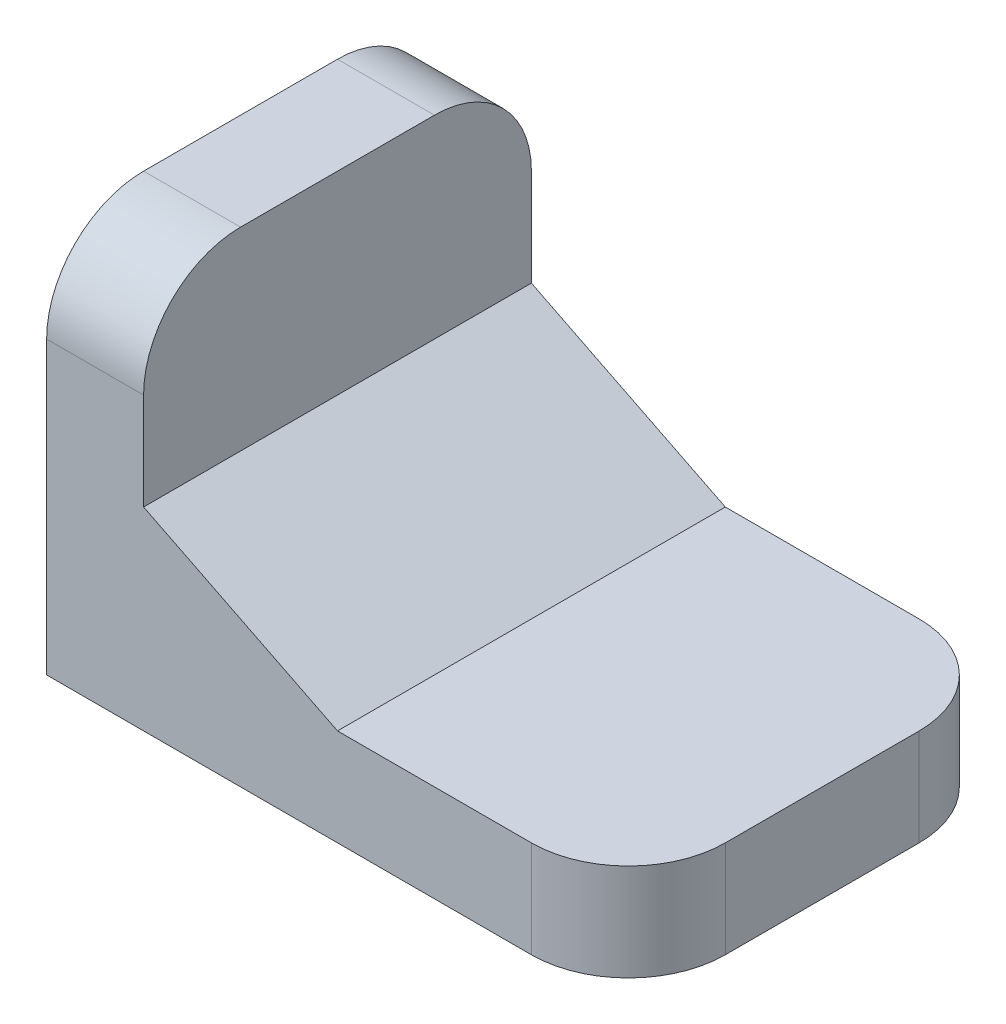
ISO-10303-21;
HEADER;
FILE_DESCRIPTION(('STEP AP214'),'2;1');
FILE_NAME('part.step','',(''),(''),'','','');
FILE_SCHEMA(('AUTOMOTIVE_DESIGN { 1 0 10303 214 1 1 1 1 }'));
ENDSEC;
DATA;
#1=APPLICATION_CONTEXT('core data for automotive mechanical design processes');
#2=APPLICATION_PROTOCOL_DEFINITION('international standard','automotive_design',2000,#1);
#3=PRODUCT_CONTEXT('',#1,'mechanical');
#4=PRODUCT('Part','Part','',(#3));
#5=PRODUCT_RELATED_PRODUCT_CATEGORY('part','',(#4));
#6=PRODUCT_DEFINITION_FORMATION('','',#4);
#7=PRODUCT_DEFINITION_CONTEXT('part definition',#1,'design');
#8=PRODUCT_DEFINITION('design','',#6,#7);
#9=PRODUCT_DEFINITION_SHAPE('','',#8);
#10=(LENGTH_UNIT() NAMED_UNIT(*) SI_UNIT(.MILLI.,.METRE.));
#11=(NAMED_UNIT(*) PLANE_ANGLE_UNIT() SI_UNIT($,.RADIAN.));
#12=(NAMED_UNIT(*) SI_UNIT($,.STERADIAN.) SOLID_ANGLE_UNIT());
#13=UNCERTAINTY_MEASURE_WITH_UNIT(LENGTH_MEASURE(1.E-05),#10,'distance_accuracy_value','');
#14=(GEOMETRIC_REPRESENTATION_CONTEXT(3) GLOBAL_UNCERTAINTY_ASSIGNED_CONTEXT((#13)) GLOBAL_UNIT_ASSIGNED_CONTEXT((#10,
#11,#12)) REPRESENTATION_CONTEXT('',''));
#15=CARTESIAN_POINT('',(0.,0.,0.));
#16=DIRECTION('',(0.,0.,1.));
#17=DIRECTION('',(1.,0.,0.));
#18=AXIS2_PLACEMENT_3D('',#15,#16,#17);
#19=CARTESIAN_POINT('',(12.4615384615385,-27.6923076923077,40.));
#20=DIRECTION('',(0.,1.,0.));
#21=DIRECTION('',(-1.,0.,0.));
#22=AXIS2_PLACEMENT_3D('',#19,#20,#21);
#23=PLANE('',#22);
#24=CARTESIAN_POINT('',(2.46153846153846,-27.6923076923077,30.));
#25=DIRECTION('',(0.,-1.,0.));
#26=DIRECTION('',(-1.,0.,0.));
#27=AXIS2_PLACEMENT_3D('',#24,#25,#26);
#28=CIRCLE('',#27,10.);
#29=CARTESIAN_POINT('',(12.4615384615385,-27.6923076923077,29.9999999999999));
#30=VERTEX_POINT('',#29);
#31=CARTESIAN_POINT('',(2.46153846153838,-27.6923076923077,40.));
#32=VERTEX_POINT('',#31);
#33=EDGE_CURVE('E138',#30,#32,#28,.T.);
#34=ORIENTED_EDGE('',*,*,#33,.T.);
#35=DIRECTION('',(1.,0.,0.));
#36=VECTOR('',#35,1.);
#37=CARTESIAN_POINT('',(12.4615384615385,-27.6923076923077,40.));
#38=LINE('',#37,#36);
#39=CARTESIAN_POINT('',(-47.5384615384615,-27.6923076923077,40.));
#40=VERTEX_POINT('',#39);
#41=EDGE_CURVE('E212',#40,#32,#38,.T.);
#42=ORIENTED_EDGE('',*,*,#41,.F.);
#43=DIRECTION('',(0.,0.,-1.));
#44=VECTOR('',#43,1.);
#45=CARTESIAN_POINT('',(-47.5384615384615,-27.6923076923077,40.));
#46=LINE('',#45,#44);
#47=CARTESIAN_POINT('',(-47.5384615384615,-27.6923076923077,0.));
#48=VERTEX_POINT('',#47);
#49=EDGE_CURVE('E142',#40,#48,#46,.T.);
#50=ORIENTED_EDGE('',*,*,#49,.T.);
#51=DIRECTION('',(1.,0.,0.));
#52=VECTOR('',#51,1.);
#53=CARTESIAN_POINT('',(12.4615384615385,-27.6923076923077,0.));
#54=LINE('',#53,#52);
#55=CARTESIAN_POINT('',(2.46153846153845,-27.6923076923077,0.));
#56=VERTEX_POINT('',#55);
#57=EDGE_CURVE('E137',#48,#56,#54,.T.);
#58=ORIENTED_EDGE('',*,*,#57,.T.);
#59=CARTESIAN_POINT('',(2.46153846153846,-27.6923076923077,10.));
#60=DIRECTION('',(0.,-1.,0.));
#61=DIRECTION('',(-1.,0.,0.));
#62=AXIS2_PLACEMENT_3D('',#59,#60,#61);
#63=CIRCLE('',#62,10.);
#64=CARTESIAN_POINT('',(12.4615384615385,-27.6923076923077,10.0000000000001));
#65=VERTEX_POINT('',#64);
#66=EDGE_CURVE('E61',#56,#65,#63,.T.);
#67=ORIENTED_EDGE('',*,*,#66,.T.);
#68=DIRECTION('',(0.,0.,-1.));
#69=VECTOR('',#68,1.);
#70=CARTESIAN_POINT('',(12.4615384615385,-27.6923076923077,40.));
#71=LINE('',#70,#69);
#72=EDGE_CURVE('E134',#30,#65,#71,.T.);
#73=ORIENTED_EDGE('',*,*,#72,.F.);
#74=EDGE_LOOP('',(#34,#42,#50,#58,#67,#73));
#75=FACE_BOUND('',#74,.T.);
#76=ADVANCED_FACE('F38',(#75),#23,.F.);
#77=CARTESIAN_POINT('',(12.4615384615385,-17.6923076923077,40.));
#78=DIRECTION('',(-1.,0.,0.));
#79=DIRECTION('',(0.,0.,1.));
#80=AXIS2_PLACEMENT_3D('',#77,#78,#79);
#81=PLANE('',#80);
#82=DIRECTION('',(0.,0.,-1.));
#83=VECTOR('',#82,1.);
#84=CARTESIAN_POINT('',(12.4615384615385,-17.6923076923077,40.));
#85=LINE('',#84,#83);
#86=CARTESIAN_POINT('',(12.4615384615385,-17.6923076923077,29.9999999999999));
#87=VERTEX_POINT('',#86);
#88=CARTESIAN_POINT('',(12.4615384615385,-17.6923076923077,10.0000000000001));
#89=VERTEX_POINT('',#88);
#90=EDGE_CURVE('E143',#87,#89,#85,.T.);
#91=ORIENTED_EDGE('',*,*,#90,.F.);
#92=DIRECTION('',(0.,-1.,0.));
#93=VECTOR('',#92,1.);
#94=CARTESIAN_POINT('',(12.4615384615384,12.3076923076923,29.9999999999999));
#95=LINE('',#94,#93);
#96=EDGE_CURVE('E127',#87,#30,#95,.T.);
#97=ORIENTED_EDGE('',*,*,#96,.T.);
#98=ORIENTED_EDGE('',*,*,#72,.T.);
#99=DIRECTION('',(0.,-1.,0.));
#100=VECTOR('',#99,1.);
#101=CARTESIAN_POINT('',(12.4615384615384,12.3076923076923,10.0000000000001));
#102=LINE('',#101,#100);
#103=EDGE_CURVE('E119',#89,#65,#102,.T.);
#104=ORIENTED_EDGE('',*,*,#103,.F.);
#105=EDGE_LOOP('',(#91,#97,#98,#104));
#106=FACE_BOUND('',#105,.T.);
#107=ADVANCED_FACE('F141',(#106),#81,.F.);
#108=CARTESIAN_POINT('',(-17.5384615384615,-17.6923076923077,40.));
#109=DIRECTION('',(0.,-1.,0.));
#110=DIRECTION('',(1.,0.,0.));
#111=AXIS2_PLACEMENT_3D('',#108,#109,#110);
#112=PLANE('',#111);
#113=CARTESIAN_POINT('',(2.46153846153845,-17.6923076923077,30.));
#114=DIRECTION('',(0.,-1.,0.));
#115=DIRECTION('',(1.,0.,0.));
#116=AXIS2_PLACEMENT_3D('',#113,#114,#115);
#117=CIRCLE('',#116,10.);
#118=CARTESIAN_POINT('',(2.46153846153845,-17.6923076923077,40.));
#119=VERTEX_POINT('',#118);
#120=EDGE_CURVE('E53',#87,#119,#117,.T.);
#121=ORIENTED_EDGE('',*,*,#120,.F.);
#122=ORIENTED_EDGE('',*,*,#90,.T.);
#123=CARTESIAN_POINT('',(2.46153846153845,-17.6923076923077,10.));
#124=DIRECTION('',(0.,-1.,0.));
#125=DIRECTION('',(1.,0.,0.));
#126=AXIS2_PLACEMENT_3D('',#123,#124,#125);
#127=CIRCLE('',#126,10.);
#128=CARTESIAN_POINT('',(2.46153846153838,-17.6923076923077,0.));
#129=VERTEX_POINT('',#128);
#130=EDGE_CURVE('E122',#129,#89,#127,.T.);
#131=ORIENTED_EDGE('',*,*,#130,.F.);
#132=DIRECTION('',(-1.,0.,0.));
#133=VECTOR('',#132,1.);
#134=CARTESIAN_POINT('',(-17.5384615384615,-17.6923076923077,0.));
#135=LINE('',#134,#133);
#136=CARTESIAN_POINT('',(-17.5384615384615,-17.6923076923077,0.));
#137=VERTEX_POINT('',#136);
#138=EDGE_CURVE('E175',#129,#137,#135,.T.);
#139=ORIENTED_EDGE('',*,*,#138,.T.);
#140=DIRECTION('',(0.,0.,-1.));
#141=VECTOR('',#140,1.);
#142=CARTESIAN_POINT('',(-17.5384615384615,-17.6923076923077,40.));
#143=LINE('',#142,#141);
#144=CARTESIAN_POINT('',(-17.5384615384615,-17.6923076923077,40.));
#145=VERTEX_POINT('',#144);
#146=EDGE_CURVE('E146',#145,#137,#143,.T.);
#147=ORIENTED_EDGE('',*,*,#146,.F.);
#148=DIRECTION('',(-1.,0.,0.));
#149=VECTOR('',#148,1.);
#150=CARTESIAN_POINT('',(-17.5384615384615,-17.6923076923077,40.));
#151=LINE('',#150,#149);
#152=EDGE_CURVE('E211',#119,#145,#151,.T.);
#153=ORIENTED_EDGE('',*,*,#152,.F.);
#154=EDGE_LOOP('',(#121,#122,#131,#139,#147,#153));
#155=FACE_BOUND('',#154,.T.);
#156=ADVANCED_FACE('F251',(#155),#112,.F.);
#157=CARTESIAN_POINT('',(0.,0.,40.));
#158=DIRECTION('',(0.,0.,-1.));
#159=DIRECTION('',(-1.,0.,0.));
#160=AXIS2_PLACEMENT_3D('',#157,#158,#159);
#161=PLANE('',#160);
#162=DIRECTION('',(0.,-1.,0.));
#163=VECTOR('',#162,1.);
#164=CARTESIAN_POINT('',(2.46153846153838,12.3076923076923,40.));
#165=LINE('',#164,#163);
#166=EDGE_CURVE('E225',#119,#32,#165,.T.);
#167=ORIENTED_EDGE('',*,*,#166,.F.);
#168=ORIENTED_EDGE('',*,*,#152,.T.);
#169=DIRECTION('',(-0.894427190999916,0.447213595499958,0.));
#170=VECTOR('',#169,1.);
#171=CARTESIAN_POINT('',(-37.5384615384615,-7.6923076923077,40.));
#172=LINE('',#171,#170);
#173=CARTESIAN_POINT('',(-37.5384615384615,-7.6923076923077,40.));
#174=VERTEX_POINT('',#173);
#175=EDGE_CURVE('E201',#145,#174,#172,.T.);
#176=ORIENTED_EDGE('',*,*,#175,.T.);
#177=DIRECTION('',(0.,1.,0.));
#178=VECTOR('',#177,1.);
#179=CARTESIAN_POINT('',(-37.5384615384615,12.3076923076923,40.));
#180=LINE('',#179,#178);
#181=CARTESIAN_POINT('',(-37.5384615384615,2.30769230769222,40.));
#182=VERTEX_POINT('',#181);
#183=EDGE_CURVE('E179',#174,#182,#180,.T.);
#184=ORIENTED_EDGE('',*,*,#183,.T.);
#185=DIRECTION('',(-1.,0.,0.));
#186=VECTOR('',#185,1.);
#187=CARTESIAN_POINT('',(-7.53846153846154,2.3076923076923,40.));
#188=LINE('',#187,#186);
#189=CARTESIAN_POINT('',(-47.5384615384615,2.3076923076923,40.));
#190=VERTEX_POINT('',#189);
#191=EDGE_CURVE('E12',#182,#190,#188,.T.);
#192=ORIENTED_EDGE('',*,*,#191,.T.);
#193=DIRECTION('',(0.,-1.,0.));
#194=VECTOR('',#193,1.);
#195=CARTESIAN_POINT('',(-47.5384615384615,-27.6923076923077,40.));
#196=LINE('',#195,#194);
#197=EDGE_CURVE('E187',#190,#40,#196,.T.);
#198=ORIENTED_EDGE('',*,*,#197,.T.);
#199=ORIENTED_EDGE('',*,*,#41,.T.);
#200=EDGE_LOOP('',(#167,#168,#176,#184,#192,#198,#199));
#201=FACE_BOUND('',#200,.T.);
#202=ADVANCED_FACE('F230',(#201),#161,.F.);
#203=CARTESIAN_POINT('',(0.,0.,0.));
#204=DIRECTION('',(0.,0.,-1.));
#205=DIRECTION('',(-1.,0.,0.));
#206=AXIS2_PLACEMENT_3D('',#203,#204,#205);
#207=PLANE('',#206);
#208=ORIENTED_EDGE('',*,*,#138,.F.);
#209=DIRECTION('',(0.,-1.,0.));
#210=VECTOR('',#209,1.);
#211=CARTESIAN_POINT('',(2.46153846153838,12.3076923076923,0.));
#212=LINE('',#211,#210);
#213=EDGE_CURVE('E128',#129,#56,#212,.T.);
#214=ORIENTED_EDGE('',*,*,#213,.T.);
#215=ORIENTED_EDGE('',*,*,#57,.F.);
#216=DIRECTION('',(0.,-1.,0.));
#217=VECTOR('',#216,1.);
#218=CARTESIAN_POINT('',(-47.5384615384615,-27.6923076923077,0.));
#219=LINE('',#218,#217);
#220=CARTESIAN_POINT('',(-47.5384615384615,2.30769230769222,0.));
#221=VERTEX_POINT('',#220);
#222=EDGE_CURVE('E164',#221,#48,#219,.T.);
#223=ORIENTED_EDGE('',*,*,#222,.F.);
#224=DIRECTION('',(-1.,0.,0.));
#225=VECTOR('',#224,1.);
#226=CARTESIAN_POINT('',(-7.53846153846154,2.3076923076923,0.));
#227=LINE('',#226,#225);
#228=CARTESIAN_POINT('',(-37.5384615384615,2.3076923076923,0.));
#229=VERTEX_POINT('',#228);
#230=EDGE_CURVE('E46',#229,#221,#227,.T.);
#231=ORIENTED_EDGE('',*,*,#230,.F.);
#232=DIRECTION('',(0.,1.,0.));
#233=VECTOR('',#232,1.);
#234=CARTESIAN_POINT('',(-37.5384615384615,12.3076923076923,0.));
#235=LINE('',#234,#233);
#236=CARTESIAN_POINT('',(-37.5384615384615,-7.6923076923077,0.));
#237=VERTEX_POINT('',#236);
#238=EDGE_CURVE('E185',#237,#229,#235,.T.);
#239=ORIENTED_EDGE('',*,*,#238,.F.);
#240=DIRECTION('',(-0.894427190999916,0.447213595499958,0.));
#241=VECTOR('',#240,1.);
#242=CARTESIAN_POINT('',(-37.5384615384615,-7.6923076923077,0.));
#243=LINE('',#242,#241);
#244=EDGE_CURVE('E183',#137,#237,#243,.T.);
#245=ORIENTED_EDGE('',*,*,#244,.F.);
#246=EDGE_LOOP('',(#208,#214,#215,#223,#231,#239,#245));
#247=FACE_BOUND('',#246,.T.);
#248=ADVANCED_FACE('F172',(#247),#207,.T.);
#249=CARTESIAN_POINT('',(-47.5384615384615,-27.6923076923077,40.));
#250=DIRECTION('',(1.,0.,0.));
#251=DIRECTION('',(0.,0.,-1.));
#252=AXIS2_PLACEMENT_3D('',#249,#250,#251);
#253=PLANE('',#252);
#254=CARTESIAN_POINT('',(-47.5384615384615,2.3076923076923,10.));
#255=DIRECTION('',(-1.,0.,0.));
#256=DIRECTION('',(0.,0.,1.));
#257=AXIS2_PLACEMENT_3D('',#254,#255,#256);
#258=CIRCLE('',#257,10.);
#259=CARTESIAN_POINT('',(-47.5384615384615,12.3076923076923,10.0000000000001));
#260=VERTEX_POINT('',#259);
#261=EDGE_CURVE('E153',#260,#221,#258,.T.);
#262=ORIENTED_EDGE('',*,*,#261,.T.);
#263=ORIENTED_EDGE('',*,*,#222,.T.);
#264=ORIENTED_EDGE('',*,*,#49,.F.);
#265=ORIENTED_EDGE('',*,*,#197,.F.);
#266=CARTESIAN_POINT('',(-47.5384615384615,2.3076923076923,30.));
#267=DIRECTION('',(-1.,0.,0.));
#268=DIRECTION('',(0.,0.,1.));
#269=AXIS2_PLACEMENT_3D('',#266,#267,#268);
#270=CIRCLE('',#269,10.);
#271=CARTESIAN_POINT('',(-47.5384615384615,12.3076923076923,29.9999999999999));
#272=VERTEX_POINT('',#271);
#273=EDGE_CURVE('E169',#190,#272,#270,.T.);
#274=ORIENTED_EDGE('',*,*,#273,.T.);
#275=DIRECTION('',(0.,0.,-1.));
#276=VECTOR('',#275,1.);
#277=CARTESIAN_POINT('',(-47.5384615384615,12.3076923076923,40.));
#278=LINE('',#277,#276);
#279=EDGE_CURVE('E167',#272,#260,#278,.T.);
#280=ORIENTED_EDGE('',*,*,#279,.T.);
#281=EDGE_LOOP('',(#262,#263,#264,#265,#274,#280));
#282=FACE_BOUND('',#281,.T.);
#283=ADVANCED_FACE('F40',(#282),#253,.F.);
#284=CARTESIAN_POINT('',(-37.5384615384615,12.3076923076923,40.));
#285=DIRECTION('',(-1.,0.,0.));
#286=DIRECTION('',(0.,0.,1.));
#287=AXIS2_PLACEMENT_3D('',#284,#285,#286);
#288=PLANE('',#287);
#289=CARTESIAN_POINT('',(-37.5384615384615,2.3076923076923,10.));
#290=DIRECTION('',(-1.,0.,0.));
#291=DIRECTION('',(0.,0.,1.));
#292=AXIS2_PLACEMENT_3D('',#289,#290,#291);
#293=CIRCLE('',#292,10.);
#294=CARTESIAN_POINT('',(-37.5384615384615,12.3076923076923,10.0000000000001));
#295=VERTEX_POINT('',#294);
#296=EDGE_CURVE('E156',#295,#229,#293,.T.);
#297=ORIENTED_EDGE('',*,*,#296,.F.);
#298=DIRECTION('',(0.,0.,-1.));
#299=VECTOR('',#298,1.);
#300=CARTESIAN_POINT('',(-37.5384615384615,12.3076923076923,40.));
#301=LINE('',#300,#299);
#302=CARTESIAN_POINT('',(-37.5384615384615,12.3076923076923,29.9999999999999));
#303=VERTEX_POINT('',#302);
#304=EDGE_CURVE('E189',#303,#295,#301,.T.);
#305=ORIENTED_EDGE('',*,*,#304,.F.);
#306=CARTESIAN_POINT('',(-37.5384615384615,2.3076923076923,30.));
#307=DIRECTION('',(-1.,0.,0.));
#308=DIRECTION('',(0.,0.,1.));
#309=AXIS2_PLACEMENT_3D('',#306,#307,#308);
#310=CIRCLE('',#309,10.);
#311=EDGE_CURVE('E173',#182,#303,#310,.T.);
#312=ORIENTED_EDGE('',*,*,#311,.F.);
#313=ORIENTED_EDGE('',*,*,#183,.F.);
#314=DIRECTION('',(0.,0.,-1.));
#315=VECTOR('',#314,1.);
#316=CARTESIAN_POINT('',(-37.5384615384615,-7.6923076923077,40.));
#317=LINE('',#316,#315);
#318=EDGE_CURVE('E192',#174,#237,#317,.T.);
#319=ORIENTED_EDGE('',*,*,#318,.T.);
#320=ORIENTED_EDGE('',*,*,#238,.T.);
#321=EDGE_LOOP('',(#297,#305,#312,#313,#319,#320));
#322=FACE_BOUND('',#321,.T.);
#323=ADVANCED_FACE('F205',(#322),#288,.F.);
#324=CARTESIAN_POINT('',(-47.5384615384615,12.3076923076923,40.));
#325=DIRECTION('',(0.,-1.,0.));
#326=DIRECTION('',(0.,0.,-1.));
#327=AXIS2_PLACEMENT_3D('',#324,#325,#326);
#328=PLANE('',#327);
#329=ORIENTED_EDGE('',*,*,#304,.T.);
#330=DIRECTION('',(-1.,0.,0.));
#331=VECTOR('',#330,1.);
#332=CARTESIAN_POINT('',(-7.53846153846154,12.3076923076923,10.0000000000001));
#333=LINE('',#332,#331);
#334=EDGE_CURVE('E219',#295,#260,#333,.T.);
#335=ORIENTED_EDGE('',*,*,#334,.T.);
#336=ORIENTED_EDGE('',*,*,#279,.F.);
#337=DIRECTION('',(-1.,0.,0.));
#338=VECTOR('',#337,1.);
#339=CARTESIAN_POINT('',(-7.53846153846154,12.3076923076923,29.9999999999999));
#340=LINE('',#339,#338);
#341=EDGE_CURVE('E168',#303,#272,#340,.T.);
#342=ORIENTED_EDGE('',*,*,#341,.F.);
#343=EDGE_LOOP('',(#329,#335,#336,#342));
#344=FACE_BOUND('',#343,.T.);
#345=ADVANCED_FACE('F235',(#344),#328,.F.);
#346=CARTESIAN_POINT('',(-37.5384615384615,-7.6923076923077,40.));
#347=DIRECTION('',(-0.447213595499958,-0.894427190999916,0.));
#348=DIRECTION('',(0.894427190999916,-0.447213595499958,0.));
#349=AXIS2_PLACEMENT_3D('',#346,#347,#348);
#350=PLANE('',#349);
#351=ORIENTED_EDGE('',*,*,#244,.T.);
#352=ORIENTED_EDGE('',*,*,#318,.F.);
#353=ORIENTED_EDGE('',*,*,#175,.F.);
#354=ORIENTED_EDGE('',*,*,#146,.T.);
#355=EDGE_LOOP('',(#351,#352,#353,#354));
#356=FACE_BOUND('',#355,.T.);
#357=ADVANCED_FACE('F199',(#356),#350,.F.);
#358=CARTESIAN_POINT('',(-7.53846153846154,2.3076923076923,10.));
#359=DIRECTION('',(-1.,0.,0.));
#360=DIRECTION('',(0.,0.,1.));
#361=AXIS2_PLACEMENT_3D('',#358,#359,#360);
#362=CYLINDRICAL_SURFACE('',#361,10.);
#363=ORIENTED_EDGE('',*,*,#296,.T.);
#364=ORIENTED_EDGE('',*,*,#230,.T.);
#365=ORIENTED_EDGE('',*,*,#261,.F.);
#366=ORIENTED_EDGE('',*,*,#334,.F.);
#367=EDGE_LOOP('',(#363,#364,#365,#366));
#368=FACE_BOUND('',#367,.T.);
#369=ADVANCED_FACE('F152',(#368),#362,.T.);
#370=CARTESIAN_POINT('',(-7.53846153846154,2.3076923076923,30.));
#371=DIRECTION('',(-1.,0.,0.));
#372=DIRECTION('',(0.,0.,1.));
#373=AXIS2_PLACEMENT_3D('',#370,#371,#372);
#374=CYLINDRICAL_SURFACE('',#373,10.);
#375=ORIENTED_EDGE('',*,*,#311,.T.);
#376=ORIENTED_EDGE('',*,*,#341,.T.);
#377=ORIENTED_EDGE('',*,*,#273,.F.);
#378=ORIENTED_EDGE('',*,*,#191,.F.);
#379=EDGE_LOOP('',(#375,#376,#377,#378));
#380=FACE_BOUND('',#379,.T.);
#381=ADVANCED_FACE('F236',(#380),#374,.T.);
#382=CARTESIAN_POINT('',(2.46153846153845,12.3076923076923,10.));
#383=DIRECTION('',(0.,-1.,0.));
#384=DIRECTION('',(1.,0.,0.));
#385=AXIS2_PLACEMENT_3D('',#382,#383,#384);
#386=CYLINDRICAL_SURFACE('',#385,10.);
#387=ORIENTED_EDGE('',*,*,#130,.T.);
#388=ORIENTED_EDGE('',*,*,#103,.T.);
#389=ORIENTED_EDGE('',*,*,#66,.F.);
#390=ORIENTED_EDGE('',*,*,#213,.F.);
#391=EDGE_LOOP('',(#387,#388,#389,#390));
#392=FACE_BOUND('',#391,.T.);
#393=ADVANCED_FACE('F120',(#392),#386,.T.);
#394=CARTESIAN_POINT('',(2.46153846153845,12.3076923076923,30.));
#395=DIRECTION('',(0.,-1.,0.));
#396=DIRECTION('',(1.,0.,0.));
#397=AXIS2_PLACEMENT_3D('',#394,#395,#396);
#398=CYLINDRICAL_SURFACE('',#397,10.);
#399=ORIENTED_EDGE('',*,*,#120,.T.);
#400=ORIENTED_EDGE('',*,*,#166,.T.);
#401=ORIENTED_EDGE('',*,*,#33,.F.);
#402=ORIENTED_EDGE('',*,*,#96,.F.);
#403=EDGE_LOOP('',(#399,#400,#401,#402));
#404=FACE_BOUND('',#403,.T.);
#405=ADVANCED_FACE('F243',(#404),#398,.T.);
#406=CLOSED_SHELL('',(#76,#107,#156,#202,#248,#283,#323,#345,#357,#369,#381,#393,#405));
#407=MANIFOLD_SOLID_BREP('B2',#406);
#408=ADVANCED_BREP_SHAPE_REPRESENTATION('',(#18,#407),#14);
#409=SHAPE_DEFINITION_REPRESENTATION(#9,#408);
ENDSEC;
END-ISO-10303-21;
